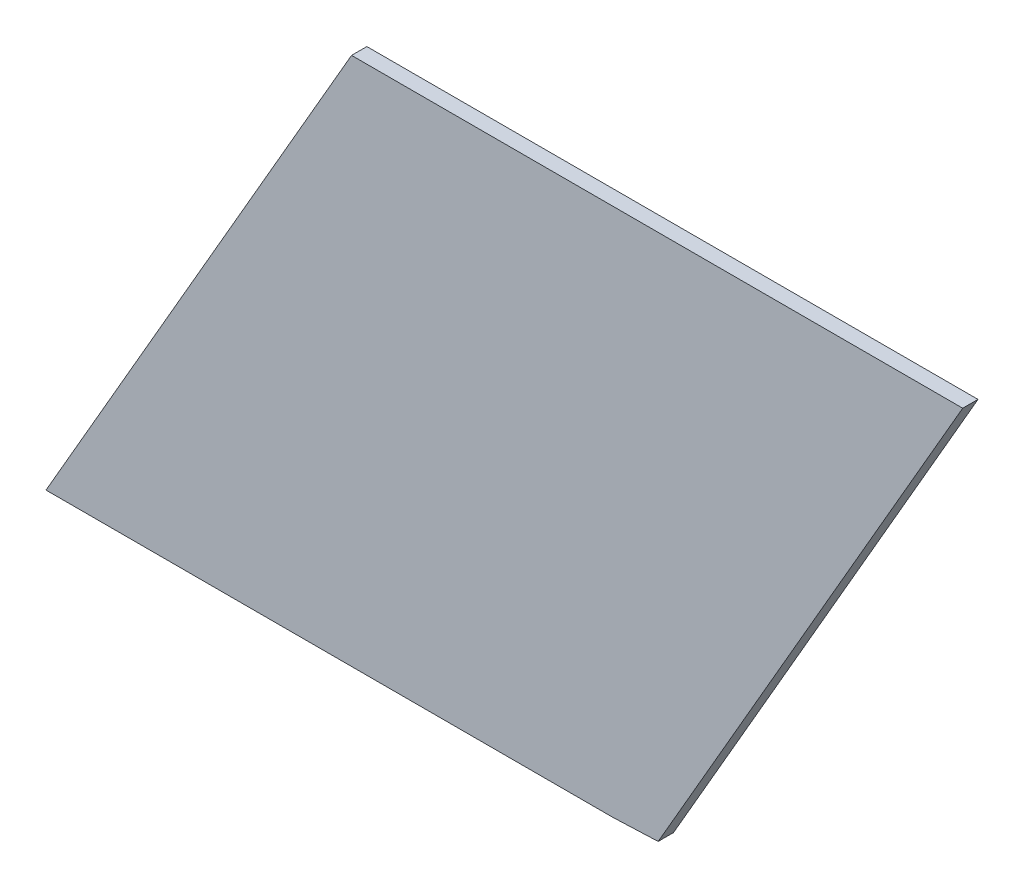
ISO-10303-21;
HEADER;
FILE_DESCRIPTION(('STEP AP214'),'2;1');
FILE_NAME('part.step','',(''),(''),'','','');
FILE_SCHEMA(('AUTOMOTIVE_DESIGN { 1 0 10303 214 1 1 1 1 }'));
ENDSEC;
DATA;
#1=APPLICATION_CONTEXT('core data for automotive mechanical design processes');
#2=APPLICATION_PROTOCOL_DEFINITION('international standard','automotive_design',2000,#1);
#3=PRODUCT_CONTEXT('',#1,'mechanical');
#4=PRODUCT('Part','Part','',(#3));
#5=PRODUCT_RELATED_PRODUCT_CATEGORY('part','',(#4));
#6=PRODUCT_DEFINITION_FORMATION('','',#4);
#7=PRODUCT_DEFINITION_CONTEXT('part definition',#1,'design');
#8=PRODUCT_DEFINITION('design','',#6,#7);
#9=PRODUCT_DEFINITION_SHAPE('','',#8);
#10=(LENGTH_UNIT() NAMED_UNIT(*) SI_UNIT(.MILLI.,.METRE.));
#11=(NAMED_UNIT(*) PLANE_ANGLE_UNIT() SI_UNIT($,.RADIAN.));
#12=(NAMED_UNIT(*) SI_UNIT($,.STERADIAN.) SOLID_ANGLE_UNIT());
#13=UNCERTAINTY_MEASURE_WITH_UNIT(LENGTH_MEASURE(1.E-05),#10,'distance_accuracy_value','');
#14=(GEOMETRIC_REPRESENTATION_CONTEXT(3) GLOBAL_UNCERTAINTY_ASSIGNED_CONTEXT((#13)) GLOBAL_UNIT_ASSIGNED_CONTEXT((#10,
#11,#12)) REPRESENTATION_CONTEXT('',''));
#15=CARTESIAN_POINT('',(0.,0.,0.));
#16=DIRECTION('',(0.,0.,1.));
#17=DIRECTION('',(1.,0.,0.));
#18=AXIS2_PLACEMENT_3D('',#15,#16,#17);
#19=CARTESIAN_POINT('',(-328.237783231021,112.984054612726,2.));
#20=DIRECTION('',(0.,-1.,0.));
#21=DIRECTION('',(1.,0.,0.));
#22=AXIS2_PLACEMENT_3D('',#19,#20,#21);
#23=PLANE('',#22);
#24=DIRECTION('',(-1.,0.,0.));
#25=VECTOR('',#24,1.);
#26=CARTESIAN_POINT('',(-328.237783231021,112.984054612726,0.));
#27=LINE('',#26,#25);
#28=CARTESIAN_POINT('',(-328.237783231021,112.984054612726,0.));
#29=VERTEX_POINT('',#28);
#30=CARTESIAN_POINT('',(-402.464280539124,112.984054612724,0.));
#31=VERTEX_POINT('',#30);
#32=EDGE_CURVE('E122',#29,#31,#27,.T.);
#33=ORIENTED_EDGE('',*,*,#32,.F.);
#34=DIRECTION('',(0.,0.,-1.));
#35=VECTOR('',#34,1.);
#36=CARTESIAN_POINT('',(-328.237783231021,112.984054612726,2.));
#37=LINE('',#36,#35);
#38=CARTESIAN_POINT('',(-328.237783231021,112.984054612726,2.));
#39=VERTEX_POINT('',#38);
#40=EDGE_CURVE('E11',#39,#29,#37,.T.);
#41=ORIENTED_EDGE('',*,*,#40,.F.);
#42=DIRECTION('',(-1.,0.,0.));
#43=VECTOR('',#42,1.);
#44=CARTESIAN_POINT('',(-328.237783231021,112.984054612726,2.));
#45=LINE('',#44,#43);
#46=CARTESIAN_POINT('',(-402.464280539124,112.984054612724,2.));
#47=VERTEX_POINT('',#46);
#48=EDGE_CURVE('E116',#39,#47,#45,.T.);
#49=ORIENTED_EDGE('',*,*,#48,.T.);
#50=DIRECTION('',(0.,0.,-1.));
#51=VECTOR('',#50,1.);
#52=CARTESIAN_POINT('',(-402.464280539124,112.984054612724,2.));
#53=LINE('',#52,#51);
#54=EDGE_CURVE('E42',#47,#31,#53,.T.);
#55=ORIENTED_EDGE('',*,*,#54,.T.);
#56=EDGE_LOOP('',(#33,#41,#49,#55));
#57=FACE_BOUND('',#56,.T.);
#58=ADVANCED_FACE('F39',(#57),#23,.T.);
#59=CARTESIAN_POINT('',(-322.328895982425,113.218547543486,2.));
#60=DIRECTION('',(0.0396535742405181,-0.999213487724196,0.));
#61=DIRECTION('',(0.999213487724196,0.0396535742405181,0.));
#62=AXIS2_PLACEMENT_3D('',#59,#60,#61);
#63=PLANE('',#62);
#64=DIRECTION('',(-0.999213487724196,-0.0396535742405181,0.));
#65=VECTOR('',#64,1.);
#66=CARTESIAN_POINT('',(-322.328895982425,113.218547543486,0.));
#67=LINE('',#66,#65);
#68=CARTESIAN_POINT('',(-322.328895982425,113.218547543486,0.));
#69=VERTEX_POINT('',#68);
#70=EDGE_CURVE('E135',#69,#29,#67,.T.);
#71=ORIENTED_EDGE('',*,*,#70,.F.);
#72=DIRECTION('',(0.,0.,-1.));
#73=VECTOR('',#72,1.);
#74=CARTESIAN_POINT('',(-322.328895982425,113.218547543486,2.));
#75=LINE('',#74,#73);
#76=CARTESIAN_POINT('',(-322.328895982425,113.218547543486,2.));
#77=VERTEX_POINT('',#76);
#78=EDGE_CURVE('E49',#77,#69,#75,.T.);
#79=ORIENTED_EDGE('',*,*,#78,.F.);
#80=DIRECTION('',(-0.999213487724196,-0.0396535742405181,0.));
#81=VECTOR('',#80,1.);
#82=CARTESIAN_POINT('',(-322.328895982425,113.218547543486,2.));
#83=LINE('',#82,#81);
#84=EDGE_CURVE('E108',#77,#39,#83,.T.);
#85=ORIENTED_EDGE('',*,*,#84,.T.);
#86=ORIENTED_EDGE('',*,*,#40,.T.);
#87=EDGE_LOOP('',(#71,#79,#85,#86));
#88=FACE_BOUND('',#87,.T.);
#89=ADVANCED_FACE('F145',(#88),#63,.T.);
#90=CARTESIAN_POINT('',(-282.464280539126,182.266086915483,2.));
#91=DIRECTION('',(0.866025403784463,-0.499999999999957,0.));
#92=DIRECTION('',(0.499999999999957,0.866025403784463,0.));
#93=AXIS2_PLACEMENT_3D('',#90,#91,#92);
#94=PLANE('',#93);
#95=DIRECTION('',(-0.499999999999957,-0.866025403784463,0.));
#96=VECTOR('',#95,1.);
#97=CARTESIAN_POINT('',(-282.464280539126,182.266086915483,0.));
#98=LINE('',#97,#96);
#99=CARTESIAN_POINT('',(-282.464280539126,182.266086915483,0.));
#100=VERTEX_POINT('',#99);
#101=EDGE_CURVE('E96',#100,#69,#98,.T.);
#102=ORIENTED_EDGE('',*,*,#101,.F.);
#103=DIRECTION('',(0.,0.,-1.));
#104=VECTOR('',#103,1.);
#105=CARTESIAN_POINT('',(-282.464280539126,182.266086915483,2.));
#106=LINE('',#105,#104);
#107=CARTESIAN_POINT('',(-282.464280539126,182.266086915483,2.));
#108=VERTEX_POINT('',#107);
#109=EDGE_CURVE('E91',#108,#100,#106,.T.);
#110=ORIENTED_EDGE('',*,*,#109,.F.);
#111=DIRECTION('',(-0.499999999999957,-0.866025403784463,0.));
#112=VECTOR('',#111,1.);
#113=CARTESIAN_POINT('',(-282.464280539126,182.266086915483,2.));
#114=LINE('',#113,#112);
#115=EDGE_CURVE('E94',#108,#77,#114,.T.);
#116=ORIENTED_EDGE('',*,*,#115,.T.);
#117=ORIENTED_EDGE('',*,*,#78,.T.);
#118=EDGE_LOOP('',(#102,#110,#116,#117));
#119=FACE_BOUND('',#118,.T.);
#120=ADVANCED_FACE('F93',(#119),#94,.T.);
#121=CARTESIAN_POINT('',(-362.464280539127,182.26608691548,2.));
#122=DIRECTION('',(0.,1.,0.));
#123=DIRECTION('',(-1.,0.,0.));
#124=AXIS2_PLACEMENT_3D('',#121,#122,#123);
#125=PLANE('',#124);
#126=DIRECTION('',(1.,0.,0.));
#127=VECTOR('',#126,1.);
#128=CARTESIAN_POINT('',(-362.464280539127,182.26608691548,0.));
#129=LINE('',#128,#127);
#130=CARTESIAN_POINT('',(-362.464280539127,182.26608691548,0.));
#131=VERTEX_POINT('',#130);
#132=EDGE_CURVE('E130',#131,#100,#129,.T.);
#133=ORIENTED_EDGE('',*,*,#132,.F.);
#134=DIRECTION('',(0.,0.,-1.));
#135=VECTOR('',#134,1.);
#136=CARTESIAN_POINT('',(-362.464280539127,182.26608691548,2.));
#137=LINE('',#136,#135);
#138=CARTESIAN_POINT('',(-362.464280539127,182.26608691548,2.));
#139=VERTEX_POINT('',#138);
#140=EDGE_CURVE('E102',#139,#131,#137,.T.);
#141=ORIENTED_EDGE('',*,*,#140,.F.);
#142=DIRECTION('',(1.,0.,0.));
#143=VECTOR('',#142,1.);
#144=CARTESIAN_POINT('',(-362.464280539127,182.26608691548,2.));
#145=LINE('',#144,#143);
#146=EDGE_CURVE('E107',#139,#108,#145,.T.);
#147=ORIENTED_EDGE('',*,*,#146,.T.);
#148=ORIENTED_EDGE('',*,*,#109,.T.);
#149=EDGE_LOOP('',(#133,#141,#147,#148));
#150=FACE_BOUND('',#149,.T.);
#151=ADVANCED_FACE('F111',(#150),#125,.T.);
#152=CARTESIAN_POINT('',(-402.464280539124,112.984054612724,2.));
#153=DIRECTION('',(-0.866025403784457,0.499999999999968,0.));
#154=DIRECTION('',(-0.499999999999968,-0.866025403784457,0.));
#155=AXIS2_PLACEMENT_3D('',#152,#153,#154);
#156=PLANE('',#155);
#157=DIRECTION('',(0.499999999999968,0.866025403784457,0.));
#158=VECTOR('',#157,1.);
#159=CARTESIAN_POINT('',(-402.464280539124,112.984054612724,0.));
#160=LINE('',#159,#158);
#161=EDGE_CURVE('E126',#31,#131,#160,.T.);
#162=ORIENTED_EDGE('',*,*,#161,.F.);
#163=ORIENTED_EDGE('',*,*,#54,.F.);
#164=DIRECTION('',(0.499999999999968,0.866025403784457,0.));
#165=VECTOR('',#164,1.);
#166=CARTESIAN_POINT('',(-402.464280539124,112.984054612724,2.));
#167=LINE('',#166,#165);
#168=EDGE_CURVE('E113',#47,#139,#167,.T.);
#169=ORIENTED_EDGE('',*,*,#168,.T.);
#170=ORIENTED_EDGE('',*,*,#140,.T.);
#171=EDGE_LOOP('',(#162,#163,#169,#170));
#172=FACE_BOUND('',#171,.T.);
#173=ADVANCED_FACE('F142',(#172),#156,.T.);
#174=CARTESIAN_POINT('',(0.,0.,2.));
#175=DIRECTION('',(0.,0.,-1.));
#176=DIRECTION('',(-1.,0.,0.));
#177=AXIS2_PLACEMENT_3D('',#174,#175,#176);
#178=PLANE('',#177);
#179=ORIENTED_EDGE('',*,*,#48,.F.);
#180=ORIENTED_EDGE('',*,*,#84,.F.);
#181=ORIENTED_EDGE('',*,*,#115,.F.);
#182=ORIENTED_EDGE('',*,*,#146,.F.);
#183=ORIENTED_EDGE('',*,*,#168,.F.);
#184=EDGE_LOOP('',(#179,#180,#181,#182,#183));
#185=FACE_BOUND('',#184,.T.);
#186=ADVANCED_FACE('F106',(#185),#178,.F.);
#187=CARTESIAN_POINT('',(0.,0.,0.));
#188=DIRECTION('',(0.,0.,-1.));
#189=DIRECTION('',(-1.,0.,0.));
#190=AXIS2_PLACEMENT_3D('',#187,#188,#189);
#191=PLANE('',#190);
#192=ORIENTED_EDGE('',*,*,#32,.T.);
#193=ORIENTED_EDGE('',*,*,#161,.T.);
#194=ORIENTED_EDGE('',*,*,#132,.T.);
#195=ORIENTED_EDGE('',*,*,#101,.T.);
#196=ORIENTED_EDGE('',*,*,#70,.T.);
#197=EDGE_LOOP('',(#192,#193,#194,#195,#196));
#198=FACE_BOUND('',#197,.T.);
#199=ADVANCED_FACE('F144',(#198),#191,.T.);
#200=CLOSED_SHELL('',(#58,#89,#120,#151,#173,#186,#199));
#201=MANIFOLD_SOLID_BREP('B2',#200);
#202=ADVANCED_BREP_SHAPE_REPRESENTATION('',(#18,#201),#14);
#203=SHAPE_DEFINITION_REPRESENTATION(#9,#202);
ENDSEC;
END-ISO-10303-21;
